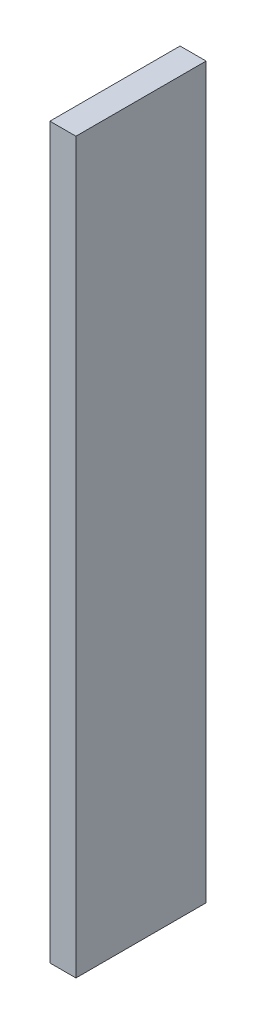
ISO-10303-21;
HEADER;
FILE_DESCRIPTION(('STEP AP214'),'2;1');
FILE_NAME('part.step','',(''),(''),'','','');
FILE_SCHEMA(('AUTOMOTIVE_DESIGN { 1 0 10303 214 1 1 1 1 }'));
ENDSEC;
DATA;
#1=APPLICATION_CONTEXT('core data for automotive mechanical design processes');
#2=APPLICATION_PROTOCOL_DEFINITION('international standard','automotive_design',2000,#1);
#3=PRODUCT_CONTEXT('',#1,'mechanical');
#4=PRODUCT('Part','Part','',(#3));
#5=PRODUCT_RELATED_PRODUCT_CATEGORY('part','',(#4));
#6=PRODUCT_DEFINITION_FORMATION('','',#4);
#7=PRODUCT_DEFINITION_CONTEXT('part definition',#1,'design');
#8=PRODUCT_DEFINITION('design','',#6,#7);
#9=PRODUCT_DEFINITION_SHAPE('','',#8);
#10=(LENGTH_UNIT() NAMED_UNIT(*) SI_UNIT(.MILLI.,.METRE.));
#11=(NAMED_UNIT(*) PLANE_ANGLE_UNIT() SI_UNIT($,.RADIAN.));
#12=(NAMED_UNIT(*) SI_UNIT($,.STERADIAN.) SOLID_ANGLE_UNIT());
#13=UNCERTAINTY_MEASURE_WITH_UNIT(LENGTH_MEASURE(1.E-05),#10,'distance_accuracy_value','');
#14=(GEOMETRIC_REPRESENTATION_CONTEXT(3) GLOBAL_UNCERTAINTY_ASSIGNED_CONTEXT((#13)) GLOBAL_UNIT_ASSIGNED_CONTEXT((#10,
#11,#12)) REPRESENTATION_CONTEXT('',''));
#15=CARTESIAN_POINT('',(0.,0.,0.));
#16=DIRECTION('',(0.,0.,1.));
#17=DIRECTION('',(1.,0.,0.));
#18=AXIS2_PLACEMENT_3D('',#15,#16,#17);
#19=CARTESIAN_POINT('',(10.,-140.,-25.));
#20=DIRECTION('',(0.,0.,1.));
#21=DIRECTION('',(1.,0.,0.));
#22=AXIS2_PLACEMENT_3D('',#19,#20,#21);
#23=PLANE('',#22);
#24=DIRECTION('',(0.,1.,0.));
#25=VECTOR('',#24,1.);
#26=CARTESIAN_POINT('',(0.,-140.,-25.));
#27=LINE('',#26,#25);
#28=CARTESIAN_POINT('',(0.,-140.,-25.));
#29=VERTEX_POINT('',#28);
#30=CARTESIAN_POINT('',(0.,140.,-25.));
#31=VERTEX_POINT('',#30);
#32=EDGE_CURVE('E98',#29,#31,#27,.T.);
#33=ORIENTED_EDGE('',*,*,#32,.T.);
#34=DIRECTION('',(-1.,0.,0.));
#35=VECTOR('',#34,1.);
#36=CARTESIAN_POINT('',(10.,140.,-25.));
#37=LINE('',#36,#35);
#38=CARTESIAN_POINT('',(10.,140.,-25.));
#39=VERTEX_POINT('',#38);
#40=EDGE_CURVE('E11',#39,#31,#37,.T.);
#41=ORIENTED_EDGE('',*,*,#40,.F.);
#42=DIRECTION('',(0.,1.,0.));
#43=VECTOR('',#42,1.);
#44=CARTESIAN_POINT('',(10.,-140.,-25.));
#45=LINE('',#44,#43);
#46=CARTESIAN_POINT('',(10.,-140.,-25.));
#47=VERTEX_POINT('',#46);
#48=EDGE_CURVE('E86',#47,#39,#45,.T.);
#49=ORIENTED_EDGE('',*,*,#48,.F.);
#50=DIRECTION('',(-1.,0.,0.));
#51=VECTOR('',#50,1.);
#52=CARTESIAN_POINT('',(10.,-140.,-25.));
#53=LINE('',#52,#51);
#54=EDGE_CURVE('E94',#47,#29,#53,.T.);
#55=ORIENTED_EDGE('',*,*,#54,.T.);
#56=EDGE_LOOP('',(#33,#41,#49,#55));
#57=FACE_BOUND('',#56,.T.);
#58=ADVANCED_FACE('F35',(#57),#23,.F.);
#59=CARTESIAN_POINT('',(10.,140.,25.));
#60=DIRECTION('',(0.,-1.,0.));
#61=DIRECTION('',(0.,0.,-1.));
#62=AXIS2_PLACEMENT_3D('',#59,#60,#61);
#63=PLANE('',#62);
#64=DIRECTION('',(0.,0.,1.));
#65=VECTOR('',#64,1.);
#66=CARTESIAN_POINT('',(0.,140.,25.));
#67=LINE('',#66,#65);
#68=CARTESIAN_POINT('',(0.,140.,25.));
#69=VERTEX_POINT('',#68);
#70=EDGE_CURVE('E90',#31,#69,#67,.T.);
#71=ORIENTED_EDGE('',*,*,#70,.T.);
#72=DIRECTION('',(-1.,0.,0.));
#73=VECTOR('',#72,1.);
#74=CARTESIAN_POINT('',(10.,140.,25.));
#75=LINE('',#74,#73);
#76=CARTESIAN_POINT('',(10.,140.,25.));
#77=VERTEX_POINT('',#76);
#78=EDGE_CURVE('E43',#77,#69,#75,.T.);
#79=ORIENTED_EDGE('',*,*,#78,.F.);
#80=DIRECTION('',(0.,0.,1.));
#81=VECTOR('',#80,1.);
#82=CARTESIAN_POINT('',(10.,140.,25.));
#83=LINE('',#82,#81);
#84=EDGE_CURVE('E81',#39,#77,#83,.T.);
#85=ORIENTED_EDGE('',*,*,#84,.F.);
#86=ORIENTED_EDGE('',*,*,#40,.T.);
#87=EDGE_LOOP('',(#71,#79,#85,#86));
#88=FACE_BOUND('',#87,.T.);
#89=ADVANCED_FACE('F89',(#88),#63,.F.);
#90=CARTESIAN_POINT('',(10.,-140.,25.));
#91=DIRECTION('',(0.,0.,-1.));
#92=DIRECTION('',(-1.,0.,0.));
#93=AXIS2_PLACEMENT_3D('',#90,#91,#92);
#94=PLANE('',#93);
#95=DIRECTION('',(0.,-1.,0.));
#96=VECTOR('',#95,1.);
#97=CARTESIAN_POINT('',(0.,-140.,25.));
#98=LINE('',#97,#96);
#99=CARTESIAN_POINT('',(0.,-140.,25.));
#100=VERTEX_POINT('',#99);
#101=EDGE_CURVE('E68',#69,#100,#98,.T.);
#102=ORIENTED_EDGE('',*,*,#101,.T.);
#103=DIRECTION('',(-1.,0.,0.));
#104=VECTOR('',#103,1.);
#105=CARTESIAN_POINT('',(10.,-140.,25.));
#106=LINE('',#105,#104);
#107=CARTESIAN_POINT('',(10.,-140.,25.));
#108=VERTEX_POINT('',#107);
#109=EDGE_CURVE('E91',#108,#100,#106,.T.);
#110=ORIENTED_EDGE('',*,*,#109,.F.);
#111=DIRECTION('',(0.,-1.,0.));
#112=VECTOR('',#111,1.);
#113=CARTESIAN_POINT('',(10.,-140.,25.));
#114=LINE('',#113,#112);
#115=EDGE_CURVE('E84',#77,#108,#114,.T.);
#116=ORIENTED_EDGE('',*,*,#115,.F.);
#117=ORIENTED_EDGE('',*,*,#78,.T.);
#118=EDGE_LOOP('',(#102,#110,#116,#117));
#119=FACE_BOUND('',#118,.T.);
#120=ADVANCED_FACE('F92',(#119),#94,.F.);
#121=CARTESIAN_POINT('',(10.,-140.,25.));
#122=DIRECTION('',(0.,1.,0.));
#123=DIRECTION('',(0.,0.,1.));
#124=AXIS2_PLACEMENT_3D('',#121,#122,#123);
#125=PLANE('',#124);
#126=DIRECTION('',(0.,0.,-1.));
#127=VECTOR('',#126,1.);
#128=CARTESIAN_POINT('',(0.,-140.,25.));
#129=LINE('',#128,#127);
#130=EDGE_CURVE('E74',#100,#29,#129,.T.);
#131=ORIENTED_EDGE('',*,*,#130,.T.);
#132=ORIENTED_EDGE('',*,*,#54,.F.);
#133=DIRECTION('',(0.,0.,-1.));
#134=VECTOR('',#133,1.);
#135=CARTESIAN_POINT('',(10.,-140.,25.));
#136=LINE('',#135,#134);
#137=EDGE_CURVE('E51',#108,#47,#136,.T.);
#138=ORIENTED_EDGE('',*,*,#137,.F.);
#139=ORIENTED_EDGE('',*,*,#109,.T.);
#140=EDGE_LOOP('',(#131,#132,#138,#139));
#141=FACE_BOUND('',#140,.T.);
#142=ADVANCED_FACE('F105',(#141),#125,.F.);
#143=CARTESIAN_POINT('',(10.,0.,0.));
#144=DIRECTION('',(-1.,0.,0.));
#145=DIRECTION('',(0.,0.,1.));
#146=AXIS2_PLACEMENT_3D('',#143,#144,#145);
#147=PLANE('',#146);
#148=ORIENTED_EDGE('',*,*,#48,.T.);
#149=ORIENTED_EDGE('',*,*,#84,.T.);
#150=ORIENTED_EDGE('',*,*,#115,.T.);
#151=ORIENTED_EDGE('',*,*,#137,.T.);
#152=EDGE_LOOP('',(#148,#149,#150,#151));
#153=FACE_BOUND('',#152,.T.);
#154=ADVANCED_FACE('F82',(#153),#147,.F.);
#155=CARTESIAN_POINT('',(0.,0.,0.));
#156=DIRECTION('',(-1.,0.,0.));
#157=DIRECTION('',(0.,0.,1.));
#158=AXIS2_PLACEMENT_3D('',#155,#156,#157);
#159=PLANE('',#158);
#160=ORIENTED_EDGE('',*,*,#32,.F.);
#161=ORIENTED_EDGE('',*,*,#130,.F.);
#162=ORIENTED_EDGE('',*,*,#101,.F.);
#163=ORIENTED_EDGE('',*,*,#70,.F.);
#164=EDGE_LOOP('',(#160,#161,#162,#163));
#165=FACE_BOUND('',#164,.T.);
#166=ADVANCED_FACE('F108',(#165),#159,.T.);
#167=CLOSED_SHELL('',(#58,#89,#120,#142,#154,#166));
#168=MANIFOLD_SOLID_BREP('B2',#167);
#169=ADVANCED_BREP_SHAPE_REPRESENTATION('',(#18,#168),#14);
#170=SHAPE_DEFINITION_REPRESENTATION(#9,#169);
ENDSEC;
END-ISO-10303-21;
